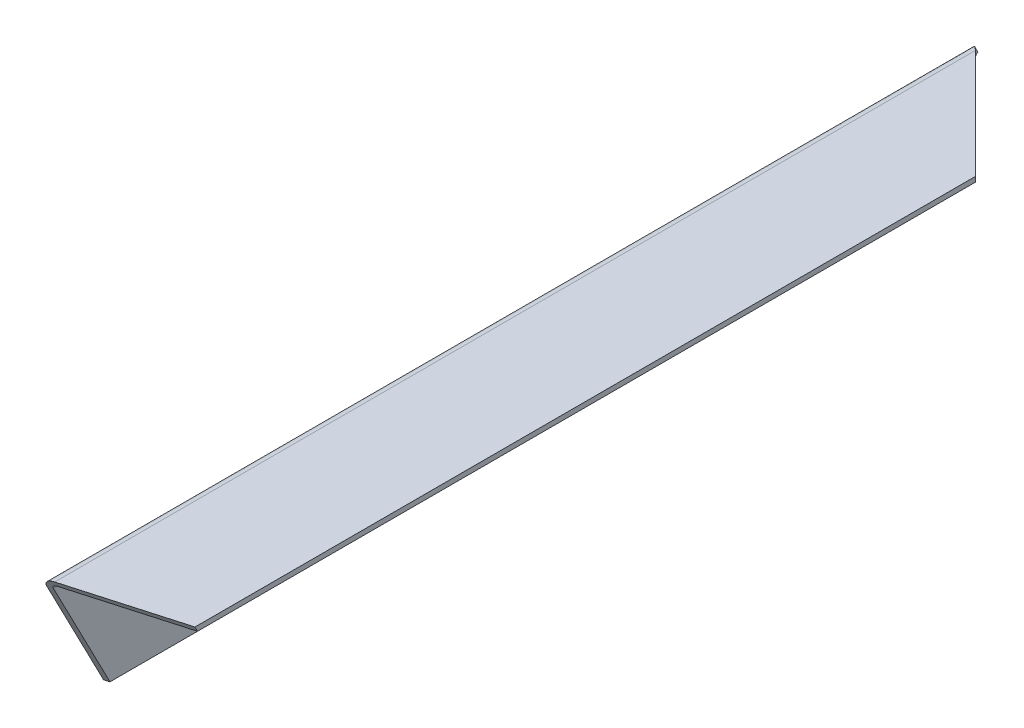
ISO-10303-21;
HEADER;
FILE_DESCRIPTION(('STEP AP214'),'2;1');
FILE_NAME('part.step','',(''),(''),'','','');
FILE_SCHEMA(('AUTOMOTIVE_DESIGN { 1 0 10303 214 1 1 1 1 }'));
ENDSEC;
DATA;
#1=APPLICATION_CONTEXT('core data for automotive mechanical design processes');
#2=APPLICATION_PROTOCOL_DEFINITION('international standard','automotive_design',2000,#1);
#3=PRODUCT_CONTEXT('',#1,'mechanical');
#4=PRODUCT('Part','Part','',(#3));
#5=PRODUCT_RELATED_PRODUCT_CATEGORY('part','',(#4));
#6=PRODUCT_DEFINITION_FORMATION('','',#4);
#7=PRODUCT_DEFINITION_CONTEXT('part definition',#1,'design');
#8=PRODUCT_DEFINITION('design','',#6,#7);
#9=PRODUCT_DEFINITION_SHAPE('','',#8);
#10=(LENGTH_UNIT() NAMED_UNIT(*) SI_UNIT(.MILLI.,.METRE.));
#11=(NAMED_UNIT(*) PLANE_ANGLE_UNIT() SI_UNIT($,.RADIAN.));
#12=(NAMED_UNIT(*) SI_UNIT($,.STERADIAN.) SOLID_ANGLE_UNIT());
#13=UNCERTAINTY_MEASURE_WITH_UNIT(LENGTH_MEASURE(1.E-05),#10,'distance_accuracy_value','');
#14=(GEOMETRIC_REPRESENTATION_CONTEXT(3) GLOBAL_UNCERTAINTY_ASSIGNED_CONTEXT((#13)) GLOBAL_UNIT_ASSIGNED_CONTEXT((#10,
#11,#12)) REPRESENTATION_CONTEXT('',''));
#15=CARTESIAN_POINT('',(0.,0.,0.));
#16=DIRECTION('',(0.,0.,1.));
#17=DIRECTION('',(1.,0.,0.));
#18=AXIS2_PLACEMENT_3D('',#15,#16,#17);
#19=CARTESIAN_POINT('',(-112.900713999999,0.188336430717542,0.));
#20=DIRECTION('',(-1.,0.,0.));
#21=DIRECTION('',(0.,0.,1.));
#22=AXIS2_PLACEMENT_3D('',#19,#20,#21);
#23=PLANE('',#22);
#24=DIRECTION('',(0.,0.,-1.));
#25=VECTOR('',#24,1.);
#26=CARTESIAN_POINT('',(-112.900714,95.4360504307374,95.2477140000016));
#27=LINE('',#26,#25);
#28=CARTESIAN_POINT('',(-112.900714,95.4360504307374,15.0995794302696));
#29=VERTEX_POINT('',#28);
#30=CARTESIAN_POINT('',(-112.900714,95.4360504307374,-95.2477140000015));
#31=VERTEX_POINT('',#30);
#32=EDGE_CURVE('E108',#29,#31,#27,.T.);
#33=ORIENTED_EDGE('',*,*,#32,.F.);
#34=DIRECTION('',(0.,0.88789948296857,0.460037507323202));
#35=VECTOR('',#34,1.);
#36=CARTESIAN_POINT('',(-112.900714,14.1783586438832,-27.0015668115113));
#37=LINE('',#36,#35);
#38=CARTESIAN_POINT('',(-112.900714,111.427514,23.3850590143518));
#39=VERTEX_POINT('',#38);
#40=EDGE_CURVE('E103',#29,#39,#37,.T.);
#41=ORIENTED_EDGE('',*,*,#40,.T.);
#42=DIRECTION('',(0.,0.,-1.));
#43=VECTOR('',#42,1.);
#44=CARTESIAN_POINT('',(-112.900714,111.427514,0.));
#45=LINE('',#44,#43);
#46=CARTESIAN_POINT('',(-112.900714,111.427514,-111.239177569261));
#47=VERTEX_POINT('',#46);
#48=EDGE_CURVE('E41',#39,#47,#45,.T.);
#49=ORIENTED_EDGE('',*,*,#48,.T.);
#50=DIRECTION('',(0.,0.707106781186616,-0.70710678118648));
#51=VECTOR('',#50,1.);
#52=CARTESIAN_POINT('',(-112.900714,112.295300430737,-112.106963999998));
#53=LINE('',#52,#51);
#54=EDGE_CURVE('E130',#31,#47,#53,.T.);
#55=ORIENTED_EDGE('',*,*,#54,.F.);
#56=EDGE_LOOP('',(#33,#41,#49,#55));
#57=FACE_BOUND('',#56,.T.);
#58=ADVANCED_FACE('F32',(#57),#23,.T.);
#59=CARTESIAN_POINT('',(-112.164114,95.4360504307374,95.2477140000016));
#60=DIRECTION('',(0.,1.,0.));
#61=DIRECTION('',(0.,0.,1.));
#62=AXIS2_PLACEMENT_3D('',#59,#60,#61);
#63=PLANE('',#62);
#64=DIRECTION('',(0.961632224178946,0.,-0.274341876899341));
#65=VECTOR('',#64,1.);
#66=CARTESIAN_POINT('',(-133.363912478139,95.4360504307372,20.9374789272936));
#67=LINE('',#66,#65);
#68=CARTESIAN_POINT('',(-112.164114,95.4360504307374,14.8894364863842));
#69=VERTEX_POINT('',#68);
#70=EDGE_CURVE('E220',#29,#69,#67,.T.);
#71=ORIENTED_EDGE('',*,*,#70,.F.);
#72=ORIENTED_EDGE('',*,*,#32,.T.);
#73=DIRECTION('',(-1.,0.,0.));
#74=VECTOR('',#73,1.);
#75=CARTESIAN_POINT('',(-112.164114,95.4360504307374,-95.2477140000015));
#76=LINE('',#75,#74);
#77=CARTESIAN_POINT('',(-112.164114,95.4360504307374,-95.2477140000015));
#78=VERTEX_POINT('',#77);
#79=EDGE_CURVE('E447',#78,#31,#76,.T.);
#80=ORIENTED_EDGE('',*,*,#79,.F.);
#81=DIRECTION('',(0.,0.,-1.));
#82=VECTOR('',#81,1.);
#83=CARTESIAN_POINT('',(-112.164114,95.4360504307374,95.2477140000016));
#84=LINE('',#83,#82);
#85=EDGE_CURVE('E132',#69,#78,#84,.T.);
#86=ORIENTED_EDGE('',*,*,#85,.F.);
#87=EDGE_LOOP('',(#71,#72,#80,#86));
#88=FACE_BOUND('',#87,.T.);
#89=ADVANCED_FACE('F155',(#88),#63,.F.);
#90=CARTESIAN_POINT('',(-112.164113999999,0.188336430717542,0.));
#91=DIRECTION('',(-1.,0.,0.));
#92=DIRECTION('',(0.,0.,1.));
#93=AXIS2_PLACEMENT_3D('',#90,#91,#92);
#94=PLANE('',#93);
#95=DIRECTION('',(0.,0.88789948296857,0.460037507323202));
#96=VECTOR('',#95,1.);
#97=CARTESIAN_POINT('',(-112.164114,14.2641951153812,-27.1672362568276));
#98=LINE('',#97,#96);
#99=CARTESIAN_POINT('',(-112.164114,111.427514,23.1749160704664));
#100=VERTEX_POINT('',#99);
#101=EDGE_CURVE('E225',#69,#100,#98,.T.);
#102=ORIENTED_EDGE('',*,*,#101,.F.);
#103=ORIENTED_EDGE('',*,*,#85,.T.);
#104=DIRECTION('',(0.,0.707106781186616,-0.70710678118648));
#105=VECTOR('',#104,1.);
#106=CARTESIAN_POINT('',(-112.164114,112.295300430737,-112.106963999998));
#107=LINE('',#106,#105);
#108=CARTESIAN_POINT('',(-112.164114,111.427514,-111.239177569261));
#109=VERTEX_POINT('',#108);
#110=EDGE_CURVE('E446',#78,#109,#107,.T.);
#111=ORIENTED_EDGE('',*,*,#110,.T.);
#112=DIRECTION('',(0.,0.,-1.));
#113=VECTOR('',#112,1.);
#114=CARTESIAN_POINT('',(-112.164114,111.427514,0.));
#115=LINE('',#114,#113);
#116=EDGE_CURVE('E35',#100,#109,#115,.T.);
#117=ORIENTED_EDGE('',*,*,#116,.F.);
#118=EDGE_LOOP('',(#102,#103,#111,#117));
#119=FACE_BOUND('',#118,.T.);
#120=ADVANCED_FACE('F151',(#119),#94,.F.);
#121=CARTESIAN_POINT('',(-95.436050430738,112.164114,95.2477140000016));
#122=DIRECTION('',(-1.,0.,0.));
#123=DIRECTION('',(0.,0.,-1.));
#124=AXIS2_PLACEMENT_3D('',#121,#122,#123);
#125=PLANE('',#124);
#126=DIRECTION('',(0.,0.887899482968571,0.460037507323202));
#127=VECTOR('',#126,1.);
#128=CARTESIAN_POINT('',(-95.4360504307381,143.396920251382,34.9665584837476));
#129=LINE('',#128,#127);
#130=CARTESIAN_POINT('',(-95.436050430738,112.164114,18.7842511277888));
#131=VERTEX_POINT('',#130);
#132=CARTESIAN_POINT('',(-95.436050430738,112.900714,19.1658975127617));
#133=VERTEX_POINT('',#132);
#134=EDGE_CURVE('E110',#131,#133,#129,.T.);
#135=ORIENTED_EDGE('',*,*,#134,.F.);
#136=DIRECTION('',(0.,0.,1.));
#137=VECTOR('',#136,1.);
#138=CARTESIAN_POINT('',(-95.436050430738,112.164114,95.2477140000016));
#139=LINE('',#138,#137);
#140=CARTESIAN_POINT('',(-95.436050430738,112.164114,-95.2477140000015));
#141=VERTEX_POINT('',#140);
#142=EDGE_CURVE('E194',#141,#131,#139,.T.);
#143=ORIENTED_EDGE('',*,*,#142,.F.);
#144=DIRECTION('',(0.,1.,0.));
#145=VECTOR('',#144,1.);
#146=CARTESIAN_POINT('',(-95.436050430738,112.164114,-95.2477140000015));
#147=LINE('',#146,#145);
#148=CARTESIAN_POINT('',(-95.436050430738,112.900714,-95.2477140000015));
#149=VERTEX_POINT('',#148);
#150=EDGE_CURVE('E189',#141,#149,#147,.T.);
#151=ORIENTED_EDGE('',*,*,#150,.T.);
#152=DIRECTION('',(0.,0.,1.));
#153=VECTOR('',#152,1.);
#154=CARTESIAN_POINT('',(-95.436050430738,112.900714,95.2477140000016));
#155=LINE('',#154,#153);
#156=EDGE_CURVE('E196',#149,#133,#155,.T.);
#157=ORIENTED_EDGE('',*,*,#156,.T.);
#158=EDGE_LOOP('',(#135,#143,#151,#157));
#159=FACE_BOUND('',#158,.T.);
#160=ADVANCED_FACE('F154',(#159),#125,.F.);
#161=CARTESIAN_POINT('',(-224.402264430758,112.164113999999,0.));
#162=DIRECTION('',(0.,1.,0.));
#163=DIRECTION('',(0.,0.,1.));
#164=AXIS2_PLACEMENT_3D('',#161,#162,#163);
#165=PLANE('',#164);
#166=DIRECTION('',(0.961632224178946,0.,-0.274341876899342));
#167=VECTOR('',#166,1.);
#168=CARTESIAN_POINT('',(-209.740234448996,112.164113999999,51.3938326211616));
#169=LINE('',#168,#167);
#170=CARTESIAN_POINT('',(-111.427514,112.164114,23.3464195115538));
#171=VERTEX_POINT('',#170);
#172=EDGE_CURVE('E109',#171,#131,#169,.T.);
#173=ORIENTED_EDGE('',*,*,#172,.F.);
#174=DIRECTION('',(0.,0.,-1.));
#175=VECTOR('',#174,1.);
#176=CARTESIAN_POINT('',(-111.427514,112.164114,0.));
#177=LINE('',#176,#175);
#178=CARTESIAN_POINT('',(-111.427514,112.164114,-111.239177569261));
#179=VERTEX_POINT('',#178);
#180=EDGE_CURVE('E188',#171,#179,#177,.T.);
#181=ORIENTED_EDGE('',*,*,#180,.T.);
#182=DIRECTION('',(0.707106781186614,0.,0.707106781186481));
#183=VECTOR('',#182,1.);
#184=CARTESIAN_POINT('',(-112.295300430738,112.164114,-112.106963999998));
#185=LINE('',#184,#183);
#186=EDGE_CURVE('E186',#179,#141,#185,.T.);
#187=ORIENTED_EDGE('',*,*,#186,.T.);
#188=ORIENTED_EDGE('',*,*,#142,.T.);
#189=EDGE_LOOP('',(#173,#181,#187,#188));
#190=FACE_BOUND('',#189,.T.);
#191=ADVANCED_FACE('F164',(#190),#165,.F.);
#192=CARTESIAN_POINT('',(-224.402264430758,112.900713999999,0.));
#193=DIRECTION('',(0.,1.,0.));
#194=DIRECTION('',(0.,0.,1.));
#195=AXIS2_PLACEMENT_3D('',#192,#193,#194);
#196=PLANE('',#195);
#197=DIRECTION('',(0.,0.,-1.));
#198=VECTOR('',#197,1.);
#199=CARTESIAN_POINT('',(-111.427514,112.900714,0.));
#200=LINE('',#199,#198);
#201=CARTESIAN_POINT('',(-111.427514,112.900714,23.7280658965268));
#202=VERTEX_POINT('',#201);
#203=CARTESIAN_POINT('',(-111.427514,112.900714,-111.239177569261));
#204=VERTEX_POINT('',#203);
#205=EDGE_CURVE('E123',#202,#204,#200,.T.);
#206=ORIENTED_EDGE('',*,*,#205,.F.);
#207=DIRECTION('',(0.961632224178946,0.,-0.274341876899342));
#208=VECTOR('',#207,1.);
#209=CARTESIAN_POINT('',(-209.639550030394,112.900713999999,51.7467549766362));
#210=LINE('',#209,#208);
#211=EDGE_CURVE('E48',#202,#133,#210,.T.);
#212=ORIENTED_EDGE('',*,*,#211,.T.);
#213=ORIENTED_EDGE('',*,*,#156,.F.);
#214=DIRECTION('',(0.707106781186614,0.,0.707106781186481));
#215=VECTOR('',#214,1.);
#216=CARTESIAN_POINT('',(-112.295300430738,112.900714,-112.106963999998));
#217=LINE('',#216,#215);
#218=EDGE_CURVE('E208',#204,#149,#217,.T.);
#219=ORIENTED_EDGE('',*,*,#218,.F.);
#220=EDGE_LOOP('',(#206,#212,#213,#219));
#221=FACE_BOUND('',#220,.T.);
#222=ADVANCED_FACE('F160',(#221),#196,.T.);
#223=CARTESIAN_POINT('',(-111.427514,111.427514,224.221855094246));
#224=DIRECTION('',(0.,0.,-1.));
#225=DIRECTION('',(1.,0.,0.));
#226=AXIS2_PLACEMENT_3D('',#223,#224,#225);
#227=CYLINDRICAL_SURFACE('',#226,0.7366);
#228=ORIENTED_EDGE('',*,*,#180,.F.);
#229=CARTESIAN_POINT('',(-111.427514,111.427514,22.964773126581));
#230=DIRECTION('',(0.245551475215283,-0.445952793407951,0.860715155595185));
#231=DIRECTION('',(0.415154852578791,-0.753974155692041,-0.509086850084302));
#232=AXIS2_PLACEMENT_3D('',#229,#230,#231);
#233=ELLIPSE('',#232,0.855799964961278,0.7366);
#234=EDGE_CURVE('E222',#171,#100,#233,.T.);
#235=ORIENTED_EDGE('',*,*,#234,.T.);
#236=ORIENTED_EDGE('',*,*,#116,.T.);
#237=CARTESIAN_POINT('',(-111.948368855022,111.948368855022,-112.106963999998));
#238=CARTESIAN_POINT('',(-112.016552378456,111.880185331588,-111.962324904643));
#239=CARTESIAN_POINT('',(-112.071145053662,111.798479740941,-111.817701856419));
#240=CARTESIAN_POINT('',(-112.144942273634,111.620317491619,-111.52843971284));
#241=CARTESIAN_POINT('',(-112.164114,111.52394006357,-111.383816664616));
#242=CARTESIAN_POINT('',(-112.164114,111.427514,-111.239177569261));
#243=B_SPLINE_CURVE_WITH_KNOTS('',3,(#237,#238,#239,#240,#241,#242),.UNSPECIFIED.,.F.,.F.,(4,2,
4),(0.,0.5,1.),.UNSPECIFIED.);
#244=CARTESIAN_POINT('',(-111.948368855022,111.948368855022,-112.106963999998));
#245=VERTEX_POINT('',#244);
#246=EDGE_CURVE('E259',#109,#245,#243,.F.);
#247=ORIENTED_EDGE('',*,*,#246,.T.);
#248=CARTESIAN_POINT('',(-111.427514,112.164114,-111.239177569261));
#249=CARTESIAN_POINT('',(-111.52394006357,112.164114,-111.383816664616));
#250=CARTESIAN_POINT('',(-111.620317491619,112.144942273634,-111.52843971284));
#251=CARTESIAN_POINT('',(-111.798479740941,112.071145053661,-111.817701856419));
#252=CARTESIAN_POINT('',(-111.880185331589,112.016552378455,-111.962324904643));
#253=CARTESIAN_POINT('',(-111.948368855022,111.948368855022,-112.106963999998));
#254=B_SPLINE_CURVE_WITH_KNOTS('',3,(#248,#249,#250,#251,#252,#253),.UNSPECIFIED.,.F.,.F.,(4,2,
4),(0.,0.5,1.),.UNSPECIFIED.);
#255=EDGE_CURVE('E335',#245,#179,#254,.F.);
#256=ORIENTED_EDGE('',*,*,#255,.T.);
#257=EDGE_LOOP('',(#228,#235,#236,#247,#256));
#258=FACE_BOUND('',#257,.T.);
#259=ADVANCED_FACE('F163',(#258),#227,.F.);
#260=CARTESIAN_POINT('',(-111.427514,111.427514,224.221855094246));
#261=DIRECTION('',(0.,0.,-1.));
#262=DIRECTION('',(1.,0.,0.));
#263=AXIS2_PLACEMENT_3D('',#260,#261,#262);
#264=CYLINDRICAL_SURFACE('',#263,1.4732);
#265=CARTESIAN_POINT('',(-111.427514,111.427514,22.964773126581));
#266=DIRECTION('',(0.245551475215283,-0.445952793407951,0.860715155595185));
#267=DIRECTION('',(0.415154852578791,-0.753974155692041,-0.509086850084302));
#268=AXIS2_PLACEMENT_3D('',#265,#266,#267);
#269=ELLIPSE('',#268,1.71159992992256,1.4732);
#270=EDGE_CURVE('E11',#202,#39,#269,.T.);
#271=ORIENTED_EDGE('',*,*,#270,.F.);
#272=ORIENTED_EDGE('',*,*,#205,.T.);
#273=CARTESIAN_POINT('',(-112.469223710044,112.469223710044,-112.106963999998));
#274=CARTESIAN_POINT('',(-112.332848493311,112.605598926776,-111.962316239192));
#275=CARTESIAN_POINT('',(-112.169445481883,112.714776107323,-111.817701856419));
#276=CARTESIAN_POINT('',(-111.813120983238,112.862370547267,-111.52843971284));
#277=CARTESIAN_POINT('',(-111.620377681075,112.900714,-111.383825330067));
#278=CARTESIAN_POINT('',(-111.427514,112.900714,-111.239177569261));
#279=B_SPLINE_CURVE_WITH_KNOTS('',3,(#273,#274,#275,#276,#277,#278),.UNSPECIFIED.,.F.,.F.,(4,2,
4),(0.,0.5,1.),.UNSPECIFIED.);
#280=CARTESIAN_POINT('',(-112.469223945747,112.469223474341,-112.106963749998));
#281=VERTEX_POINT('',#280);
#282=EDGE_CURVE('E334',#281,#204,#279,.T.);
#283=ORIENTED_EDGE('',*,*,#282,.F.);
#284=CARTESIAN_POINT('',(-112.900714,111.427514,-111.239177569261));
#285=CARTESIAN_POINT('',(-112.900714,111.620377681075,-111.383825330067));
#286=CARTESIAN_POINT('',(-112.862370547268,111.813120983238,-111.52843971284));
#287=CARTESIAN_POINT('',(-112.714776107324,112.169445481882,-111.817701856419));
#288=CARTESIAN_POINT('',(-112.605598926777,112.332848493311,-111.962316239192));
#289=CARTESIAN_POINT('',(-112.469223710044,112.469223710044,-112.106963999998));
#290=B_SPLINE_CURVE_WITH_KNOTS('',3,(#284,#285,#286,#287,#288,#289),.UNSPECIFIED.,.F.,.F.,(4,2,
4),(0.,0.5,1.),.UNSPECIFIED.);
#291=EDGE_CURVE('E116',#47,#281,#290,.T.);
#292=ORIENTED_EDGE('',*,*,#291,.F.);
#293=ORIENTED_EDGE('',*,*,#48,.F.);
#294=EDGE_LOOP('',(#271,#272,#283,#292,#293));
#295=FACE_BOUND('',#294,.T.);
#296=ADVANCED_FACE('F113',(#295),#264,.T.);
#297=CARTESIAN_POINT('',(-112.164114,112.295300430737,-112.106963999998));
#298=DIRECTION('',(0.,0.70710678118648,0.707106781186616));
#299=DIRECTION('',(0.,-0.707106781186616,0.70710678118648));
#300=AXIS2_PLACEMENT_3D('',#297,#298,#299);
#301=PLANE('',#300);
#302=CARTESIAN_POINT('',(-112.164114,111.427514,-111.239177569261));
#303=CARTESIAN_POINT('',(-112.900714,111.427514,-111.239177569261));
#304=B_SPLINE_CURVE_WITH_KNOTS('',1,(#302,#303),.UNSPECIFIED.,.F.,.F.,(2,2),(0.,1.),.UNSPECIFIED.);
#305=EDGE_CURVE('E118',#109,#47,#304,.T.);
#306=ORIENTED_EDGE('',*,*,#305,.F.);
#307=ORIENTED_EDGE('',*,*,#110,.F.);
#308=ORIENTED_EDGE('',*,*,#79,.T.);
#309=ORIENTED_EDGE('',*,*,#54,.T.);
#310=EDGE_LOOP('',(#306,#307,#308,#309));
#311=FACE_BOUND('',#310,.T.);
#312=ADVANCED_FACE('F141',(#311),#301,.F.);
#313=CARTESIAN_POINT('',(-112.295300430738,112.164114,-112.106963999998));
#314=DIRECTION('',(-0.707106781186481,0.,0.707106781186614));
#315=DIRECTION('',(-0.707106781186614,0.,-0.707106781186481));
#316=AXIS2_PLACEMENT_3D('',#313,#314,#315);
#317=PLANE('',#316);
#318=ORIENTED_EDGE('',*,*,#186,.F.);
#319=CARTESIAN_POINT('',(-111.427514,112.900714,-111.239177569261));
#320=CARTESIAN_POINT('',(-111.427514,112.164114,-111.239177569261));
#321=B_SPLINE_CURVE_WITH_KNOTS('',1,(#319,#320),.UNSPECIFIED.,.F.,.F.,(2,2),(0.,1.),.UNSPECIFIED.);
#322=EDGE_CURVE('E209',#179,#204,#321,.F.);
#323=ORIENTED_EDGE('',*,*,#322,.T.);
#324=ORIENTED_EDGE('',*,*,#218,.T.);
#325=ORIENTED_EDGE('',*,*,#150,.F.);
#326=EDGE_LOOP('',(#318,#323,#324,#325));
#327=FACE_BOUND('',#326,.T.);
#328=ADVANCED_FACE('F150',(#327),#317,.F.);
#329=CARTESIAN_POINT('',(-112.900714,111.427514,-111.239177569261));
#330=CARTESIAN_POINT('',(-112.900714,111.620377681075,-111.383825330067));
#331=CARTESIAN_POINT('',(-112.862370547268,111.813120983238,-111.52843971284));
#332=CARTESIAN_POINT('',(-112.714776107324,112.169445481882,-111.817701856419));
#333=CARTESIAN_POINT('',(-112.605598926777,112.332848493311,-111.962316239192));
#334=CARTESIAN_POINT('',(-112.469223710044,112.469223710044,-112.106963999998));
#335=CARTESIAN_POINT('',(-112.164114,111.427514,-111.239177569261));
#336=CARTESIAN_POINT('',(-112.164114,111.52394006357,-111.383816664616));
#337=CARTESIAN_POINT('',(-112.144942273634,111.620317491619,-111.52843971284));
#338=CARTESIAN_POINT('',(-112.071145053662,111.798479740941,-111.817701856419));
#339=CARTESIAN_POINT('',(-112.016552378456,111.880185331588,-111.962324904643));
#340=CARTESIAN_POINT('',(-111.948368855022,111.948368855022,-112.106963999998));
#341=B_SPLINE_SURFACE_WITH_KNOTS('',1,3,((#329,#330,#331,#332,#333,#334),(#335,#336,#337,#338,
#339,#340)),.UNSPECIFIED.,.F.,.F.,.F.,(2,2),(4,2,4),(0.,1.),(0.,0.5,1.),.UNSPECIFIED.);
#342=CARTESIAN_POINT('',(-112.469223710044,112.469223710044,-112.106963999998));
#343=CARTESIAN_POINT('',(-111.948368855022,111.948368855022,-112.106963999998));
#344=B_SPLINE_CURVE_WITH_KNOTS('',1,(#342,#343),.UNSPECIFIED.,.F.,.F.,(2,2),(0.,1.),.UNSPECIFIED.);
#345=EDGE_CURVE('E318',#281,#245,#344,.T.);
#346=ORIENTED_EDGE('',*,*,#305,.T.);
#347=ORIENTED_EDGE('',*,*,#291,.T.);
#348=ORIENTED_EDGE('',*,*,#345,.T.);
#349=ORIENTED_EDGE('',*,*,#246,.F.);
#350=EDGE_LOOP('',(#346,#347,#348,#349));
#351=FACE_BOUND('',#350,.T.);
#352=ADVANCED_FACE('F169',(#351),#341,.F.);
#353=CARTESIAN_POINT('',(-112.469223710044,112.469223710044,-112.106963999998));
#354=CARTESIAN_POINT('',(-112.332848493311,112.605598926776,-111.962316239192));
#355=CARTESIAN_POINT('',(-112.169445481883,112.714776107323,-111.817701856419));
#356=CARTESIAN_POINT('',(-111.813120983238,112.862370547267,-111.52843971284));
#357=CARTESIAN_POINT('',(-111.620377681075,112.900714,-111.383825330067));
#358=CARTESIAN_POINT('',(-111.427514,112.900714,-111.239177569261));
#359=CARTESIAN_POINT('',(-111.948368855022,111.948368855022,-112.106963999998));
#360=CARTESIAN_POINT('',(-111.880185331589,112.016552378455,-111.962324904643));
#361=CARTESIAN_POINT('',(-111.798479740941,112.071145053661,-111.817701856419));
#362=CARTESIAN_POINT('',(-111.620317491619,112.144942273634,-111.52843971284));
#363=CARTESIAN_POINT('',(-111.52394006357,112.164114,-111.383816664616));
#364=CARTESIAN_POINT('',(-111.427514,112.164114,-111.239177569261));
#365=B_SPLINE_SURFACE_WITH_KNOTS('',1,3,((#353,#354,#355,#356,#357,#358),(#359,#360,#361,#362,
#363,#364)),.UNSPECIFIED.,.F.,.F.,.F.,(2,2),(4,2,4),(0.,1.),(0.,0.5,1.),.UNSPECIFIED.);
#366=ORIENTED_EDGE('',*,*,#345,.F.);
#367=ORIENTED_EDGE('',*,*,#282,.T.);
#368=ORIENTED_EDGE('',*,*,#322,.F.);
#369=ORIENTED_EDGE('',*,*,#255,.F.);
#370=EDGE_LOOP('',(#366,#367,#368,#369));
#371=FACE_BOUND('',#370,.T.);
#372=ADVANCED_FACE('F289',(#371),#365,.F.);
#373=CARTESIAN_POINT('',(-68.9078774769948,-8.30044554866632,-51.1988767971413));
#374=DIRECTION('',(0.245551475215283,-0.445952793407951,0.860715155595185));
#375=DIRECTION('',(0.,-0.887899482968571,-0.460037507323201));
#376=AXIS2_PLACEMENT_3D('',#373,#374,#375);
#377=PLANE('',#376);
#378=ORIENTED_EDGE('',*,*,#101,.T.);
#379=ORIENTED_EDGE('',*,*,#234,.F.);
#380=ORIENTED_EDGE('',*,*,#172,.T.);
#381=ORIENTED_EDGE('',*,*,#134,.T.);
#382=ORIENTED_EDGE('',*,*,#211,.F.);
#383=ORIENTED_EDGE('',*,*,#270,.T.);
#384=ORIENTED_EDGE('',*,*,#40,.F.);
#385=ORIENTED_EDGE('',*,*,#70,.T.);
#386=EDGE_LOOP('',(#378,#379,#380,#381,#382,#383,#384,#385));
#387=FACE_BOUND('',#386,.T.);
#388=ADVANCED_FACE('F102',(#387),#377,.T.);
#389=CLOSED_SHELL('',(#58,#89,#120,#160,#191,#222,#259,#296,#312,#328,#352,#372,#388));
#390=MANIFOLD_SOLID_BREP('B2',#389);
#391=ADVANCED_BREP_SHAPE_REPRESENTATION('',(#18,#390),#14);
#392=SHAPE_DEFINITION_REPRESENTATION(#9,#391);
ENDSEC;
END-ISO-10303-21;
